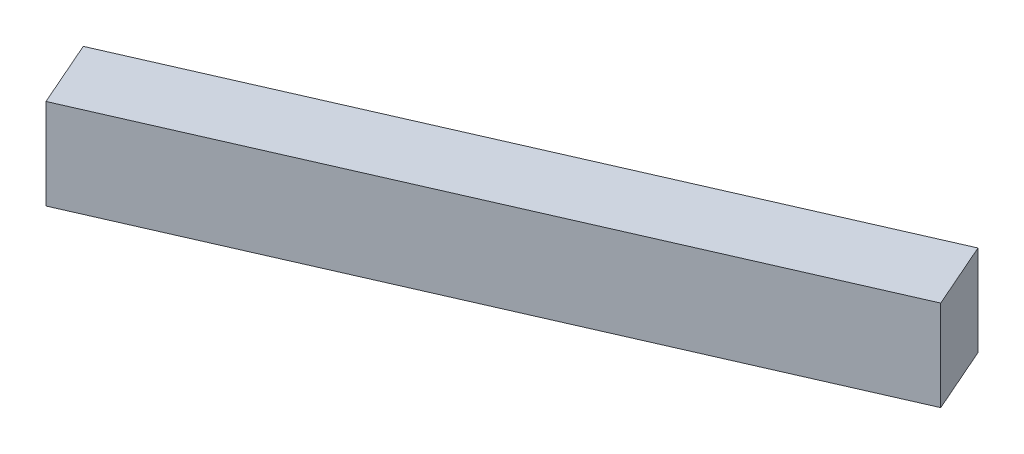
ISO-10303-21;
HEADER;
FILE_DESCRIPTION(('STEP AP214'),'2;1');
FILE_NAME('part.step','',(''),(''),'','','');
FILE_SCHEMA(('AUTOMOTIVE_DESIGN { 1 0 10303 214 1 1 1 1 }'));
ENDSEC;
DATA;
#1=APPLICATION_CONTEXT('core data for automotive mechanical design processes');
#2=APPLICATION_PROTOCOL_DEFINITION('international standard','automotive_design',2000,#1);
#3=PRODUCT_CONTEXT('',#1,'mechanical');
#4=PRODUCT('Part','Part','',(#3));
#5=PRODUCT_RELATED_PRODUCT_CATEGORY('part','',(#4));
#6=PRODUCT_DEFINITION_FORMATION('','',#4);
#7=PRODUCT_DEFINITION_CONTEXT('part definition',#1,'design');
#8=PRODUCT_DEFINITION('design','',#6,#7);
#9=PRODUCT_DEFINITION_SHAPE('','',#8);
#10=(LENGTH_UNIT() NAMED_UNIT(*) SI_UNIT(.MILLI.,.METRE.));
#11=(NAMED_UNIT(*) PLANE_ANGLE_UNIT() SI_UNIT($,.RADIAN.));
#12=(NAMED_UNIT(*) SI_UNIT($,.STERADIAN.) SOLID_ANGLE_UNIT());
#13=UNCERTAINTY_MEASURE_WITH_UNIT(LENGTH_MEASURE(1.E-05),#10,'distance_accuracy_value','');
#14=(GEOMETRIC_REPRESENTATION_CONTEXT(3) GLOBAL_UNCERTAINTY_ASSIGNED_CONTEXT((#13)) GLOBAL_UNIT_ASSIGNED_CONTEXT((#10,
#11,#12)) REPRESENTATION_CONTEXT('',''));
#15=CARTESIAN_POINT('',(0.,0.,0.));
#16=DIRECTION('',(0.,0.,1.));
#17=DIRECTION('',(1.,0.,0.));
#18=AXIS2_PLACEMENT_3D('',#15,#16,#17);
#19=CARTESIAN_POINT('',(-16.4411145076615,7.874,7.3201151452855));
#20=DIRECTION('',(-0.401596157839399,0.,-0.915816862701617));
#21=DIRECTION('',(-0.915816862701617,0.,0.401596157839399));
#22=AXIS2_PLACEMENT_3D('',#19,#20,#21);
#23=PLANE('',#22);
#24=DIRECTION('',(0.,1.,0.));
#25=VECTOR('',#24,1.);
#26=CARTESIAN_POINT('',(-16.4411145076615,7.874,7.3201151452855));
#27=LINE('',#26,#25);
#28=CARTESIAN_POINT('',(-16.4411145076615,7.62,7.3201151452855));
#29=VERTEX_POINT('',#28);
#30=CARTESIAN_POINT('',(-16.4411145076615,7.874,7.3201151452855));
#31=VERTEX_POINT('',#30);
#32=EDGE_CURVE('E20',#29,#31,#27,.T.);
#33=ORIENTED_EDGE('',*,*,#32,.T.);
#34=DIRECTION('',(0.91581686270162,0.,-0.401596157839393));
#35=VECTOR('',#34,1.);
#36=CARTESIAN_POINT('',(-18.1857456311081,7.874,8.08515582596955));
#37=LINE('',#36,#35);
#38=CARTESIAN_POINT('',(-18.1857456311081,7.874,8.08515582596955));
#39=VERTEX_POINT('',#38);
#40=EDGE_CURVE('E55',#39,#31,#37,.T.);
#41=ORIENTED_EDGE('',*,*,#40,.F.);
#42=DIRECTION('',(0.,1.,0.));
#43=VECTOR('',#42,1.);
#44=CARTESIAN_POINT('',(-18.1857456311081,7.874,8.08515582596955));
#45=LINE('',#44,#43);
#46=CARTESIAN_POINT('',(-18.1857456311081,7.62,8.08515582596955));
#47=VERTEX_POINT('',#46);
#48=EDGE_CURVE('E76',#39,#47,#45,.F.);
#49=ORIENTED_EDGE('',*,*,#48,.T.);
#50=DIRECTION('',(0.91581686270162,0.,-0.401596157839393));
#51=VECTOR('',#50,1.);
#52=CARTESIAN_POINT('',(-18.1857456311081,7.62,8.08515582596955));
#53=LINE('',#52,#51);
#54=EDGE_CURVE('E58',#47,#29,#53,.T.);
#55=ORIENTED_EDGE('',*,*,#54,.T.);
#56=EDGE_LOOP('',(#33,#41,#49,#55));
#57=FACE_BOUND('',#56,.T.);
#58=ADVANCED_FACE('F17',(#57),#23,.F.);
#59=CARTESIAN_POINT('',(-16.4411145076615,7.874,7.3201151452855));
#60=DIRECTION('',(-0.915816862701606,0.,0.401596157839425));
#61=DIRECTION('',(0.401596157839425,0.,0.915816862701606));
#62=AXIS2_PLACEMENT_3D('',#59,#60,#61);
#63=PLANE('',#62);
#64=DIRECTION('',(0.,1.,0.));
#65=VECTOR('',#64,1.);
#66=CARTESIAN_POINT('',(-16.5227188469345,7.874,7.13402115878452));
#67=LINE('',#66,#65);
#68=CARTESIAN_POINT('',(-16.5227188469345,7.62,7.13402115878452));
#69=VERTEX_POINT('',#68);
#70=CARTESIAN_POINT('',(-16.5227188469345,7.874,7.13402115878452));
#71=VERTEX_POINT('',#70);
#72=EDGE_CURVE('E73',#69,#71,#67,.T.);
#73=ORIENTED_EDGE('',*,*,#72,.T.);
#74=DIRECTION('',(-0.401596157839524,0.,-0.915816862701562));
#75=VECTOR('',#74,1.);
#76=CARTESIAN_POINT('',(-16.4411145076615,7.874,7.3201151452855));
#77=LINE('',#76,#75);
#78=EDGE_CURVE('E63',#31,#71,#77,.T.);
#79=ORIENTED_EDGE('',*,*,#78,.F.);
#80=ORIENTED_EDGE('',*,*,#32,.F.);
#81=DIRECTION('',(-0.401596157839524,0.,-0.915816862701562));
#82=VECTOR('',#81,1.);
#83=CARTESIAN_POINT('',(-16.4411145076615,7.62,7.3201151452855));
#84=LINE('',#83,#82);
#85=EDGE_CURVE('E80',#29,#69,#84,.T.);
#86=ORIENTED_EDGE('',*,*,#85,.T.);
#87=EDGE_LOOP('',(#73,#79,#80,#86));
#88=FACE_BOUND('',#87,.T.);
#89=ADVANCED_FACE('F72',(#88),#63,.F.);
#90=CARTESIAN_POINT('',(-16.5227188469345,7.874,7.13402115878452));
#91=DIRECTION('',(0.,1.,0.));
#92=DIRECTION('',(0.,0.,1.));
#93=AXIS2_PLACEMENT_3D('',#90,#91,#92);
#94=PLANE('',#93);
#95=DIRECTION('',(-0.401596159233574,0.,-0.915816862090255));
#96=VECTOR('',#95,1.);
#97=CARTESIAN_POINT('',(-18.1857456311081,7.874,8.08515582596955));
#98=LINE('',#97,#96);
#99=CARTESIAN_POINT('',(-18.2673499706644,7.874,7.8990618395928));
#100=VERTEX_POINT('',#99);
#101=EDGE_CURVE('E69',#100,#39,#98,.F.);
#102=ORIENTED_EDGE('',*,*,#101,.T.);
#103=ORIENTED_EDGE('',*,*,#40,.T.);
#104=ORIENTED_EDGE('',*,*,#78,.T.);
#105=DIRECTION('',(0.915816862701617,0.,-0.401596157839399));
#106=VECTOR('',#105,1.);
#107=CARTESIAN_POINT('',(-16.5227188469345,7.874,7.13402115878452));
#108=LINE('',#107,#106);
#109=EDGE_CURVE('E83',#71,#100,#108,.F.);
#110=ORIENTED_EDGE('',*,*,#109,.T.);
#111=EDGE_LOOP('',(#102,#103,#104,#110));
#112=FACE_BOUND('',#111,.T.);
#113=ADVANCED_FACE('F66',(#112),#94,.T.);
#114=CARTESIAN_POINT('',(-18.1857456311081,7.874,8.08515582596955));
#115=DIRECTION('',(0.915816862090255,0.,-0.401596159233574));
#116=DIRECTION('',(-0.401596159233574,0.,-0.915816862090255));
#117=AXIS2_PLACEMENT_3D('',#114,#115,#116);
#118=PLANE('',#117);
#119=ORIENTED_EDGE('',*,*,#48,.F.);
#120=ORIENTED_EDGE('',*,*,#101,.F.);
#121=DIRECTION('',(0.,1.,0.));
#122=VECTOR('',#121,1.);
#123=CARTESIAN_POINT('',(-18.2673499706644,7.874,7.89906183959281));
#124=LINE('',#123,#122);
#125=CARTESIAN_POINT('',(-18.2673499706644,7.62,7.8990618395928));
#126=VERTEX_POINT('',#125);
#127=EDGE_CURVE('E26',#100,#126,#124,.F.);
#128=ORIENTED_EDGE('',*,*,#127,.T.);
#129=DIRECTION('',(0.401596159233704,0.,0.915816862090198));
#130=VECTOR('',#129,1.);
#131=CARTESIAN_POINT('',(-18.2673499706644,7.62,7.8990618395928));
#132=LINE('',#131,#130);
#133=EDGE_CURVE('E34',#126,#47,#132,.T.);
#134=ORIENTED_EDGE('',*,*,#133,.T.);
#135=EDGE_LOOP('',(#119,#120,#128,#134));
#136=FACE_BOUND('',#135,.T.);
#137=ADVANCED_FACE('F88',(#136),#118,.F.);
#138=CARTESIAN_POINT('',(-16.5227188469345,7.62,7.13402115878452));
#139=DIRECTION('',(0.,1.,0.));
#140=DIRECTION('',(0.,0.,1.));
#141=AXIS2_PLACEMENT_3D('',#138,#139,#140);
#142=PLANE('',#141);
#143=ORIENTED_EDGE('',*,*,#54,.F.);
#144=ORIENTED_EDGE('',*,*,#133,.F.);
#145=DIRECTION('',(0.915816862701617,0.,-0.401596157839399));
#146=VECTOR('',#145,1.);
#147=CARTESIAN_POINT('',(-16.5227188469345,7.62,7.13402115878452));
#148=LINE('',#147,#146);
#149=EDGE_CURVE('E11',#126,#69,#148,.T.);
#150=ORIENTED_EDGE('',*,*,#149,.T.);
#151=ORIENTED_EDGE('',*,*,#85,.F.);
#152=EDGE_LOOP('',(#143,#144,#150,#151));
#153=FACE_BOUND('',#152,.T.);
#154=ADVANCED_FACE('F91',(#153),#142,.F.);
#155=CARTESIAN_POINT('',(-16.5227188469345,7.874,7.13402115878452));
#156=DIRECTION('',(0.401596157839399,0.,0.915816862701617));
#157=DIRECTION('',(0.915816862701617,0.,-0.401596157839399));
#158=AXIS2_PLACEMENT_3D('',#155,#156,#157);
#159=PLANE('',#158);
#160=ORIENTED_EDGE('',*,*,#127,.F.);
#161=ORIENTED_EDGE('',*,*,#109,.F.);
#162=ORIENTED_EDGE('',*,*,#72,.F.);
#163=ORIENTED_EDGE('',*,*,#149,.F.);
#164=EDGE_LOOP('',(#160,#161,#162,#163));
#165=FACE_BOUND('',#164,.T.);
#166=ADVANCED_FACE('F90',(#165),#159,.F.);
#167=CLOSED_SHELL('',(#58,#89,#113,#137,#154,#166));
#168=MANIFOLD_SOLID_BREP('B1',#167);
#169=ADVANCED_BREP_SHAPE_REPRESENTATION('',(#18,#168),#14);
#170=SHAPE_DEFINITION_REPRESENTATION(#9,#169);
ENDSEC;
END-ISO-10303-21;
